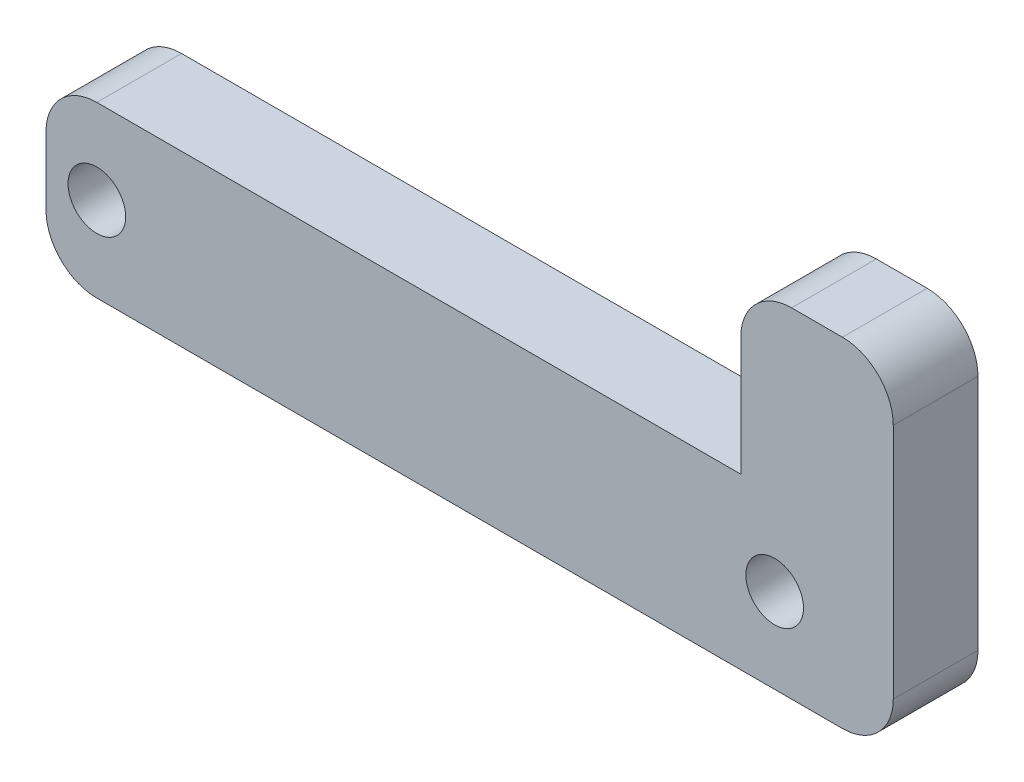
ISO-10303-21;
HEADER;
FILE_DESCRIPTION(('STEP AP214'),'2;1');
FILE_NAME('part.step','',(''),(''),'','','');
FILE_SCHEMA(('AUTOMOTIVE_DESIGN { 1 0 10303 214 1 1 1 1 }'));
ENDSEC;
DATA;
#1=APPLICATION_CONTEXT('core data for automotive mechanical design processes');
#2=APPLICATION_PROTOCOL_DEFINITION('international standard','automotive_design',2000,#1);
#3=PRODUCT_CONTEXT('',#1,'mechanical');
#4=PRODUCT('Part','Part','',(#3));
#5=PRODUCT_RELATED_PRODUCT_CATEGORY('part','',(#4));
#6=PRODUCT_DEFINITION_FORMATION('','',#4);
#7=PRODUCT_DEFINITION_CONTEXT('part definition',#1,'design');
#8=PRODUCT_DEFINITION('design','',#6,#7);
#9=PRODUCT_DEFINITION_SHAPE('','',#8);
#10=(LENGTH_UNIT() NAMED_UNIT(*) SI_UNIT(.MILLI.,.METRE.));
#11=(NAMED_UNIT(*) PLANE_ANGLE_UNIT() SI_UNIT($,.RADIAN.));
#12=(NAMED_UNIT(*) SI_UNIT($,.STERADIAN.) SOLID_ANGLE_UNIT());
#13=UNCERTAINTY_MEASURE_WITH_UNIT(LENGTH_MEASURE(1.E-05),#10,'distance_accuracy_value','');
#14=(GEOMETRIC_REPRESENTATION_CONTEXT(3) GLOBAL_UNCERTAINTY_ASSIGNED_CONTEXT((#13)) GLOBAL_UNIT_ASSIGNED_CONTEXT((#10,
#11,#12)) REPRESENTATION_CONTEXT('',''));
#15=CARTESIAN_POINT('',(0.,0.,0.));
#16=DIRECTION('',(0.,0.,1.));
#17=DIRECTION('',(1.,0.,0.));
#18=AXIS2_PLACEMENT_3D('',#15,#16,#17);
#19=CARTESIAN_POINT('',(0.,0.,-5.));
#20=DIRECTION('',(-1.,0.,0.));
#21=DIRECTION('',(0.,0.,1.));
#22=AXIS2_PLACEMENT_3D('',#19,#20,#21);
#23=PLANE('',#22);
#24=DIRECTION('',(0.,-1.,0.));
#25=VECTOR('',#24,1.);
#26=CARTESIAN_POINT('',(0.,0.,-5.));
#27=LINE('',#26,#25);
#28=CARTESIAN_POINT('',(0.,7.,-5.));
#29=VERTEX_POINT('',#28);
#30=CARTESIAN_POINT('',(0.,3.,-5.));
#31=VERTEX_POINT('',#30);
#32=EDGE_CURVE('E168',#29,#31,#27,.T.);
#33=ORIENTED_EDGE('',*,*,#32,.T.);
#34=DIRECTION('',(0.,0.,1.));
#35=VECTOR('',#34,1.);
#36=CARTESIAN_POINT('',(0.,3.,-5.));
#37=LINE('',#36,#35);
#38=CARTESIAN_POINT('',(0.,3.,0.));
#39=VERTEX_POINT('',#38);
#40=EDGE_CURVE('E214',#31,#39,#37,.T.);
#41=ORIENTED_EDGE('',*,*,#40,.T.);
#42=DIRECTION('',(0.,-1.,0.));
#43=VECTOR('',#42,1.);
#44=CARTESIAN_POINT('',(0.,0.,0.));
#45=LINE('',#44,#43);
#46=CARTESIAN_POINT('',(0.,7.,0.));
#47=VERTEX_POINT('',#46);
#48=EDGE_CURVE('E165',#47,#39,#45,.T.);
#49=ORIENTED_EDGE('',*,*,#48,.F.);
#50=DIRECTION('',(0.,0.,1.));
#51=VECTOR('',#50,1.);
#52=CARTESIAN_POINT('',(0.,7.,-5.));
#53=LINE('',#52,#51);
#54=EDGE_CURVE('E193',#47,#29,#53,.F.);
#55=ORIENTED_EDGE('',*,*,#54,.T.);
#56=EDGE_LOOP('',(#33,#41,#49,#55));
#57=FACE_BOUND('',#56,.T.);
#58=ADVANCED_FACE('F40',(#57),#23,.T.);
#59=CARTESIAN_POINT('',(0.,20.,-5.));
#60=DIRECTION('',(0.,1.,0.));
#61=DIRECTION('',(0.,0.,1.));
#62=AXIS2_PLACEMENT_3D('',#59,#60,#61);
#63=PLANE('',#62);
#64=DIRECTION('',(-1.,0.,0.));
#65=VECTOR('',#64,1.);
#66=CARTESIAN_POINT('',(0.,20.,0.));
#67=LINE('',#66,#65);
#68=CARTESIAN_POINT('',(47.,20.,0.));
#69=VERTEX_POINT('',#68);
#70=CARTESIAN_POINT('',(44.,20.,0.));
#71=VERTEX_POINT('',#70);
#72=EDGE_CURVE('E172',#69,#71,#67,.T.);
#73=ORIENTED_EDGE('',*,*,#72,.F.);
#74=DIRECTION('',(0.,0.,1.));
#75=VECTOR('',#74,1.);
#76=CARTESIAN_POINT('',(47.,20.,-5.));
#77=LINE('',#76,#75);
#78=CARTESIAN_POINT('',(47.,20.,-5.));
#79=VERTEX_POINT('',#78);
#80=EDGE_CURVE('E212',#69,#79,#77,.F.);
#81=ORIENTED_EDGE('',*,*,#80,.T.);
#82=DIRECTION('',(-1.,0.,0.));
#83=VECTOR('',#82,1.);
#84=CARTESIAN_POINT('',(0.,20.,-5.));
#85=LINE('',#84,#83);
#86=CARTESIAN_POINT('',(44.,20.,-5.));
#87=VERTEX_POINT('',#86);
#88=EDGE_CURVE('E174',#79,#87,#85,.T.);
#89=ORIENTED_EDGE('',*,*,#88,.T.);
#90=DIRECTION('',(0.,0.,1.));
#91=VECTOR('',#90,1.);
#92=CARTESIAN_POINT('',(44.,20.,0.));
#93=LINE('',#92,#91);
#94=EDGE_CURVE('E176',#87,#71,#93,.T.);
#95=ORIENTED_EDGE('',*,*,#94,.T.);
#96=EDGE_LOOP('',(#73,#81,#89,#95));
#97=FACE_BOUND('',#96,.T.);
#98=ADVANCED_FACE('F235',(#97),#63,.T.);
#99=CARTESIAN_POINT('',(0.,0.,-5.));
#100=DIRECTION('',(0.,-1.,0.));
#101=DIRECTION('',(0.,0.,-1.));
#102=AXIS2_PLACEMENT_3D('',#99,#100,#101);
#103=PLANE('',#102);
#104=DIRECTION('',(1.,0.,0.));
#105=VECTOR('',#104,1.);
#106=CARTESIAN_POINT('',(0.,0.,0.));
#107=LINE('',#106,#105);
#108=CARTESIAN_POINT('',(3.,0.,0.));
#109=VERTEX_POINT('',#108);
#110=CARTESIAN_POINT('',(47.,0.,0.));
#111=VERTEX_POINT('',#110);
#112=EDGE_CURVE('E178',#109,#111,#107,.T.);
#113=ORIENTED_EDGE('',*,*,#112,.F.);
#114=DIRECTION('',(0.,0.,1.));
#115=VECTOR('',#114,1.);
#116=CARTESIAN_POINT('',(3.,0.,-5.));
#117=LINE('',#116,#115);
#118=CARTESIAN_POINT('',(3.,0.,-5.));
#119=VERTEX_POINT('',#118);
#120=EDGE_CURVE('E48',#109,#119,#117,.F.);
#121=ORIENTED_EDGE('',*,*,#120,.T.);
#122=DIRECTION('',(1.,0.,0.));
#123=VECTOR('',#122,1.);
#124=CARTESIAN_POINT('',(0.,0.,-5.));
#125=LINE('',#124,#123);
#126=CARTESIAN_POINT('',(47.,0.,-5.));
#127=VERTEX_POINT('',#126);
#128=EDGE_CURVE('E171',#119,#127,#125,.T.);
#129=ORIENTED_EDGE('',*,*,#128,.T.);
#130=DIRECTION('',(0.,0.,1.));
#131=VECTOR('',#130,1.);
#132=CARTESIAN_POINT('',(47.,0.,-5.));
#133=LINE('',#132,#131);
#134=EDGE_CURVE('E195',#127,#111,#133,.T.);
#135=ORIENTED_EDGE('',*,*,#134,.T.);
#136=EDGE_LOOP('',(#113,#121,#129,#135));
#137=FACE_BOUND('',#136,.T.);
#138=ADVANCED_FACE('F241',(#137),#103,.T.);
#139=CARTESIAN_POINT('',(0.,0.,-5.));
#140=DIRECTION('',(0.,0.,-1.));
#141=DIRECTION('',(-1.,0.,0.));
#142=AXIS2_PLACEMENT_3D('',#139,#140,#141);
#143=PLANE('',#142);
#144=ORIENTED_EDGE('',*,*,#128,.F.);
#145=CARTESIAN_POINT('',(3.,3.,-5.));
#146=DIRECTION('',(0.,0.,-1.));
#147=DIRECTION('',(-1.,0.,0.));
#148=AXIS2_PLACEMENT_3D('',#145,#146,#147);
#149=CIRCLE('',#148,3.);
#150=EDGE_CURVE('E12',#119,#31,#149,.T.);
#151=ORIENTED_EDGE('',*,*,#150,.T.);
#152=ORIENTED_EDGE('',*,*,#32,.F.);
#153=CARTESIAN_POINT('',(3.,7.,-5.));
#154=DIRECTION('',(0.,0.,-1.));
#155=DIRECTION('',(-1.,0.,0.));
#156=AXIS2_PLACEMENT_3D('',#153,#154,#155);
#157=CIRCLE('',#156,3.);
#158=CARTESIAN_POINT('',(3.,10.,-5.));
#159=VERTEX_POINT('',#158);
#160=EDGE_CURVE('E131',#29,#159,#157,.T.);
#161=ORIENTED_EDGE('',*,*,#160,.T.);
#162=DIRECTION('',(1.,0.,0.));
#163=VECTOR('',#162,1.);
#164=CARTESIAN_POINT('',(0.,10.,-5.));
#165=LINE('',#164,#163);
#166=CARTESIAN_POINT('',(41.,10.,-5.));
#167=VERTEX_POINT('',#166);
#168=EDGE_CURVE('E121',#159,#167,#165,.T.);
#169=ORIENTED_EDGE('',*,*,#168,.T.);
#170=DIRECTION('',(0.,1.,0.));
#171=VECTOR('',#170,1.);
#172=CARTESIAN_POINT('',(41.,0.,-5.));
#173=LINE('',#172,#171);
#174=CARTESIAN_POINT('',(41.,17.,-5.));
#175=VERTEX_POINT('',#174);
#176=EDGE_CURVE('E127',#167,#175,#173,.T.);
#177=ORIENTED_EDGE('',*,*,#176,.T.);
#178=CARTESIAN_POINT('',(44.,17.,-5.));
#179=DIRECTION('',(0.,0.,-1.));
#180=DIRECTION('',(-1.,0.,0.));
#181=AXIS2_PLACEMENT_3D('',#178,#179,#180);
#182=CIRCLE('',#181,3.);
#183=EDGE_CURVE('E189',#175,#87,#182,.T.);
#184=ORIENTED_EDGE('',*,*,#183,.T.);
#185=ORIENTED_EDGE('',*,*,#88,.F.);
#186=CARTESIAN_POINT('',(47.,17.,-5.));
#187=DIRECTION('',(0.,0.,-1.));
#188=DIRECTION('',(-1.,0.,0.));
#189=AXIS2_PLACEMENT_3D('',#186,#187,#188);
#190=CIRCLE('',#189,3.);
#191=CARTESIAN_POINT('',(50.,17.,-5.));
#192=VERTEX_POINT('',#191);
#193=EDGE_CURVE('E207',#79,#192,#190,.T.);
#194=ORIENTED_EDGE('',*,*,#193,.T.);
#195=DIRECTION('',(0.,1.,0.));
#196=VECTOR('',#195,1.);
#197=CARTESIAN_POINT('',(50.,0.,-5.));
#198=LINE('',#197,#196);
#199=CARTESIAN_POINT('',(50.,3.,-5.));
#200=VERTEX_POINT('',#199);
#201=EDGE_CURVE('E154',#200,#192,#198,.T.);
#202=ORIENTED_EDGE('',*,*,#201,.F.);
#203=CARTESIAN_POINT('',(47.,3.,-5.));
#204=DIRECTION('',(0.,0.,-1.));
#205=DIRECTION('',(-1.,0.,0.));
#206=AXIS2_PLACEMENT_3D('',#203,#204,#205);
#207=CIRCLE('',#206,3.);
#208=EDGE_CURVE('E209',#200,#127,#207,.T.);
#209=ORIENTED_EDGE('',*,*,#208,.T.);
#210=EDGE_LOOP('',(#144,#151,#152,#161,#169,#177,#184,#185,#194,#202,#209));
#211=FACE_BOUND('',#210,.T.);
#212=CARTESIAN_POINT('',(43.,5.,-5.));
#213=DIRECTION('',(0.,0.,1.));
#214=DIRECTION('',(1.,0.,0.));
#215=AXIS2_PLACEMENT_3D('',#212,#213,#214);
#216=CIRCLE('',#215,1.7);
#217=CARTESIAN_POINT('',(44.7,5.,-5.));
#218=VERTEX_POINT('',#217);
#219=EDGE_CURVE('E156',#218,#218,#216,.T.);
#220=ORIENTED_EDGE('',*,*,#219,.T.);
#221=EDGE_LOOP('',(#220));
#222=FACE_BOUND('',#221,.T.);
#223=CARTESIAN_POINT('',(3.,5.,-5.));
#224=DIRECTION('',(0.,0.,1.));
#225=DIRECTION('',(1.,0.,0.));
#226=AXIS2_PLACEMENT_3D('',#223,#224,#225);
#227=CIRCLE('',#226,1.7);
#228=CARTESIAN_POINT('',(4.7,5.,-5.));
#229=VERTEX_POINT('',#228);
#230=EDGE_CURVE('E162',#229,#229,#227,.T.);
#231=ORIENTED_EDGE('',*,*,#230,.T.);
#232=EDGE_LOOP('',(#231));
#233=FACE_BOUND('',#232,.T.);
#234=ADVANCED_FACE('F123',(#211,#222,#233),#143,.T.);
#235=CARTESIAN_POINT('',(0.,0.,0.));
#236=DIRECTION('',(0.,0.,-1.));
#237=DIRECTION('',(-1.,0.,0.));
#238=AXIS2_PLACEMENT_3D('',#235,#236,#237);
#239=PLANE('',#238);
#240=CARTESIAN_POINT('',(43.,5.,0.));
#241=DIRECTION('',(0.,0.,1.));
#242=DIRECTION('',(1.,0.,0.));
#243=AXIS2_PLACEMENT_3D('',#240,#241,#242);
#244=CIRCLE('',#243,1.7);
#245=CARTESIAN_POINT('',(44.7,5.,0.));
#246=VERTEX_POINT('',#245);
#247=EDGE_CURVE('E145',#246,#246,#244,.T.);
#248=ORIENTED_EDGE('',*,*,#247,.F.);
#249=EDGE_LOOP('',(#248));
#250=FACE_BOUND('',#249,.T.);
#251=CARTESIAN_POINT('',(3.,5.,0.));
#252=DIRECTION('',(0.,0.,1.));
#253=DIRECTION('',(1.,0.,0.));
#254=AXIS2_PLACEMENT_3D('',#251,#252,#253);
#255=CIRCLE('',#254,1.7);
#256=CARTESIAN_POINT('',(4.7,5.,0.));
#257=VERTEX_POINT('',#256);
#258=EDGE_CURVE('E159',#257,#257,#255,.T.);
#259=ORIENTED_EDGE('',*,*,#258,.F.);
#260=EDGE_LOOP('',(#259));
#261=FACE_BOUND('',#260,.T.);
#262=ORIENTED_EDGE('',*,*,#48,.T.);
#263=CARTESIAN_POINT('',(3.,3.,0.));
#264=DIRECTION('',(0.,0.,-1.));
#265=DIRECTION('',(-1.,0.,0.));
#266=AXIS2_PLACEMENT_3D('',#263,#264,#265);
#267=CIRCLE('',#266,3.);
#268=EDGE_CURVE('E62',#39,#109,#267,.F.);
#269=ORIENTED_EDGE('',*,*,#268,.T.);
#270=ORIENTED_EDGE('',*,*,#112,.T.);
#271=CARTESIAN_POINT('',(47.,3.,0.));
#272=DIRECTION('',(0.,0.,-1.));
#273=DIRECTION('',(-1.,0.,0.));
#274=AXIS2_PLACEMENT_3D('',#271,#272,#273);
#275=CIRCLE('',#274,3.);
#276=CARTESIAN_POINT('',(50.,3.,0.));
#277=VERTEX_POINT('',#276);
#278=EDGE_CURVE('E200',#111,#277,#275,.F.);
#279=ORIENTED_EDGE('',*,*,#278,.T.);
#280=DIRECTION('',(0.,1.,0.));
#281=VECTOR('',#280,1.);
#282=CARTESIAN_POINT('',(50.,0.,0.));
#283=LINE('',#282,#281);
#284=CARTESIAN_POINT('',(50.,17.,0.));
#285=VERTEX_POINT('',#284);
#286=EDGE_CURVE('E269',#277,#285,#283,.T.);
#287=ORIENTED_EDGE('',*,*,#286,.T.);
#288=CARTESIAN_POINT('',(47.,17.,0.));
#289=DIRECTION('',(0.,0.,-1.));
#290=DIRECTION('',(-1.,0.,0.));
#291=AXIS2_PLACEMENT_3D('',#288,#289,#290);
#292=CIRCLE('',#291,3.);
#293=EDGE_CURVE('E198',#285,#69,#292,.F.);
#294=ORIENTED_EDGE('',*,*,#293,.T.);
#295=ORIENTED_EDGE('',*,*,#72,.T.);
#296=CARTESIAN_POINT('',(44.,17.,0.));
#297=DIRECTION('',(0.,0.,-1.));
#298=DIRECTION('',(-1.,0.,0.));
#299=AXIS2_PLACEMENT_3D('',#296,#297,#298);
#300=CIRCLE('',#299,3.);
#301=CARTESIAN_POINT('',(41.,17.,0.));
#302=VERTEX_POINT('',#301);
#303=EDGE_CURVE('E185',#71,#302,#300,.F.);
#304=ORIENTED_EDGE('',*,*,#303,.T.);
#305=DIRECTION('',(0.,1.,0.));
#306=VECTOR('',#305,1.);
#307=CARTESIAN_POINT('',(41.,0.,0.));
#308=LINE('',#307,#306);
#309=CARTESIAN_POINT('',(41.,10.,0.));
#310=VERTEX_POINT('',#309);
#311=EDGE_CURVE('E135',#310,#302,#308,.T.);
#312=ORIENTED_EDGE('',*,*,#311,.F.);
#313=DIRECTION('',(1.,0.,0.));
#314=VECTOR('',#313,1.);
#315=CARTESIAN_POINT('',(0.,10.,0.));
#316=LINE('',#315,#314);
#317=CARTESIAN_POINT('',(3.,10.,0.));
#318=VERTEX_POINT('',#317);
#319=EDGE_CURVE('E141',#318,#310,#316,.T.);
#320=ORIENTED_EDGE('',*,*,#319,.F.);
#321=CARTESIAN_POINT('',(3.,7.,0.));
#322=DIRECTION('',(0.,0.,-1.));
#323=DIRECTION('',(-1.,0.,0.));
#324=AXIS2_PLACEMENT_3D('',#321,#322,#323);
#325=CIRCLE('',#324,3.);
#326=EDGE_CURVE('E183',#318,#47,#325,.F.);
#327=ORIENTED_EDGE('',*,*,#326,.T.);
#328=EDGE_LOOP('',(#262,#269,#270,#279,#287,#294,#295,#304,#312,#320,#327));
#329=FACE_BOUND('',#328,.T.);
#330=ADVANCED_FACE('F223',(#250,#261,#329),#239,.F.);
#331=CARTESIAN_POINT('',(3.,5.,-5.));
#332=DIRECTION('',(0.,0.,1.));
#333=DIRECTION('',(1.,0.,0.));
#334=AXIS2_PLACEMENT_3D('',#331,#332,#333);
#335=CYLINDRICAL_SURFACE('',#334,1.7);
#336=ORIENTED_EDGE('',*,*,#230,.F.);
#337=EDGE_LOOP('',(#336));
#338=FACE_BOUND('',#337,.T.);
#339=ORIENTED_EDGE('',*,*,#258,.T.);
#340=EDGE_LOOP('',(#339));
#341=FACE_BOUND('',#340,.T.);
#342=ADVANCED_FACE('F283',(#338,#341),#335,.F.);
#343=CARTESIAN_POINT('',(43.,5.,-5.));
#344=DIRECTION('',(0.,0.,1.));
#345=DIRECTION('',(1.,0.,0.));
#346=AXIS2_PLACEMENT_3D('',#343,#344,#345);
#347=CYLINDRICAL_SURFACE('',#346,1.7);
#348=ORIENTED_EDGE('',*,*,#219,.F.);
#349=EDGE_LOOP('',(#348));
#350=FACE_BOUND('',#349,.T.);
#351=ORIENTED_EDGE('',*,*,#247,.T.);
#352=EDGE_LOOP('',(#351));
#353=FACE_BOUND('',#352,.T.);
#354=ADVANCED_FACE('F289',(#350,#353),#347,.F.);
#355=CARTESIAN_POINT('',(0.,10.,-5.));
#356=DIRECTION('',(0.,-1.,0.));
#357=DIRECTION('',(0.,0.,-1.));
#358=AXIS2_PLACEMENT_3D('',#355,#356,#357);
#359=PLANE('',#358);
#360=ORIENTED_EDGE('',*,*,#168,.F.);
#361=DIRECTION('',(0.,0.,1.));
#362=VECTOR('',#361,1.);
#363=CARTESIAN_POINT('',(3.,10.,0.));
#364=LINE('',#363,#362);
#365=EDGE_CURVE('E191',#159,#318,#364,.T.);
#366=ORIENTED_EDGE('',*,*,#365,.T.);
#367=ORIENTED_EDGE('',*,*,#319,.T.);
#368=DIRECTION('',(0.,0.,1.));
#369=VECTOR('',#368,1.);
#370=CARTESIAN_POINT('',(41.,10.,-5.));
#371=LINE('',#370,#369);
#372=EDGE_CURVE('E138',#167,#310,#371,.T.);
#373=ORIENTED_EDGE('',*,*,#372,.F.);
#374=EDGE_LOOP('',(#360,#366,#367,#373));
#375=FACE_BOUND('',#374,.T.);
#376=ADVANCED_FACE('F139',(#375),#359,.F.);
#377=CARTESIAN_POINT('',(41.,0.,-5.));
#378=DIRECTION('',(1.,0.,0.));
#379=DIRECTION('',(0.,0.,-1.));
#380=AXIS2_PLACEMENT_3D('',#377,#378,#379);
#381=PLANE('',#380);
#382=ORIENTED_EDGE('',*,*,#311,.T.);
#383=DIRECTION('',(0.,0.,1.));
#384=VECTOR('',#383,1.);
#385=CARTESIAN_POINT('',(41.,17.,-5.));
#386=LINE('',#385,#384);
#387=EDGE_CURVE('E149',#302,#175,#386,.F.);
#388=ORIENTED_EDGE('',*,*,#387,.T.);
#389=ORIENTED_EDGE('',*,*,#176,.F.);
#390=ORIENTED_EDGE('',*,*,#372,.T.);
#391=EDGE_LOOP('',(#382,#388,#389,#390));
#392=FACE_BOUND('',#391,.T.);
#393=ADVANCED_FACE('F147',(#392),#381,.F.);
#394=CARTESIAN_POINT('',(44.,17.,-5.));
#395=DIRECTION('',(0.,0.,-1.));
#396=DIRECTION('',(-1.,0.,0.));
#397=AXIS2_PLACEMENT_3D('',#394,#395,#396);
#398=CYLINDRICAL_SURFACE('',#397,3.);
#399=ORIENTED_EDGE('',*,*,#183,.F.);
#400=ORIENTED_EDGE('',*,*,#387,.F.);
#401=ORIENTED_EDGE('',*,*,#303,.F.);
#402=ORIENTED_EDGE('',*,*,#94,.F.);
#403=EDGE_LOOP('',(#399,#400,#401,#402));
#404=FACE_BOUND('',#403,.T.);
#405=ADVANCED_FACE('F246',(#404),#398,.T.);
#406=CARTESIAN_POINT('',(3.,7.,-5.));
#407=DIRECTION('',(0.,0.,-1.));
#408=DIRECTION('',(-1.,0.,0.));
#409=AXIS2_PLACEMENT_3D('',#406,#407,#408);
#410=CYLINDRICAL_SURFACE('',#409,3.);
#411=ORIENTED_EDGE('',*,*,#160,.F.);
#412=ORIENTED_EDGE('',*,*,#54,.F.);
#413=ORIENTED_EDGE('',*,*,#326,.F.);
#414=ORIENTED_EDGE('',*,*,#365,.F.);
#415=EDGE_LOOP('',(#411,#412,#413,#414));
#416=FACE_BOUND('',#415,.T.);
#417=ADVANCED_FACE('F225',(#416),#410,.T.);
#418=CARTESIAN_POINT('',(50.,0.,-5.));
#419=DIRECTION('',(1.,0.,0.));
#420=DIRECTION('',(0.,0.,-1.));
#421=AXIS2_PLACEMENT_3D('',#418,#419,#420);
#422=PLANE('',#421);
#423=ORIENTED_EDGE('',*,*,#286,.F.);
#424=DIRECTION('',(0.,0.,1.));
#425=VECTOR('',#424,1.);
#426=CARTESIAN_POINT('',(50.,3.,-5.));
#427=LINE('',#426,#425);
#428=EDGE_CURVE('E205',#277,#200,#427,.F.);
#429=ORIENTED_EDGE('',*,*,#428,.T.);
#430=ORIENTED_EDGE('',*,*,#201,.T.);
#431=DIRECTION('',(0.,0.,1.));
#432=VECTOR('',#431,1.);
#433=CARTESIAN_POINT('',(50.,17.,-5.));
#434=LINE('',#433,#432);
#435=EDGE_CURVE('E202',#192,#285,#434,.T.);
#436=ORIENTED_EDGE('',*,*,#435,.T.);
#437=EDGE_LOOP('',(#423,#429,#430,#436));
#438=FACE_BOUND('',#437,.T.);
#439=ADVANCED_FACE('F252',(#438),#422,.T.);
#440=CARTESIAN_POINT('',(47.,3.,-5.));
#441=DIRECTION('',(0.,0.,1.));
#442=DIRECTION('',(1.,0.,0.));
#443=AXIS2_PLACEMENT_3D('',#440,#441,#442);
#444=CYLINDRICAL_SURFACE('',#443,3.);
#445=ORIENTED_EDGE('',*,*,#208,.F.);
#446=ORIENTED_EDGE('',*,*,#428,.F.);
#447=ORIENTED_EDGE('',*,*,#278,.F.);
#448=ORIENTED_EDGE('',*,*,#134,.F.);
#449=EDGE_LOOP('',(#445,#446,#447,#448));
#450=FACE_BOUND('',#449,.T.);
#451=ADVANCED_FACE('F232',(#450),#444,.T.);
#452=CARTESIAN_POINT('',(47.,17.,-5.));
#453=DIRECTION('',(0.,0.,1.));
#454=DIRECTION('',(1.,0.,0.));
#455=AXIS2_PLACEMENT_3D('',#452,#453,#454);
#456=CYLINDRICAL_SURFACE('',#455,3.);
#457=ORIENTED_EDGE('',*,*,#193,.F.);
#458=ORIENTED_EDGE('',*,*,#80,.F.);
#459=ORIENTED_EDGE('',*,*,#293,.F.);
#460=ORIENTED_EDGE('',*,*,#435,.F.);
#461=EDGE_LOOP('',(#457,#458,#459,#460));
#462=FACE_BOUND('',#461,.T.);
#463=ADVANCED_FACE('F227',(#462),#456,.T.);
#464=CARTESIAN_POINT('',(3.,3.,-5.));
#465=DIRECTION('',(0.,0.,1.));
#466=DIRECTION('',(1.,0.,0.));
#467=AXIS2_PLACEMENT_3D('',#464,#465,#466);
#468=CYLINDRICAL_SURFACE('',#467,3.);
#469=ORIENTED_EDGE('',*,*,#150,.F.);
#470=ORIENTED_EDGE('',*,*,#120,.F.);
#471=ORIENTED_EDGE('',*,*,#268,.F.);
#472=ORIENTED_EDGE('',*,*,#40,.F.);
#473=EDGE_LOOP('',(#469,#470,#471,#472));
#474=FACE_BOUND('',#473,.T.);
#475=ADVANCED_FACE('F42',(#474),#468,.T.);
#476=CLOSED_SHELL('',(#58,#98,#138,#234,#330,#342,#354,#376,#393,#405,#417,#439,#451,#463,#475));
#477=MANIFOLD_SOLID_BREP('B2',#476);
#478=ADVANCED_BREP_SHAPE_REPRESENTATION('',(#18,#477),#14);
#479=SHAPE_DEFINITION_REPRESENTATION(#9,#478);
ENDSEC;
END-ISO-10303-21;
